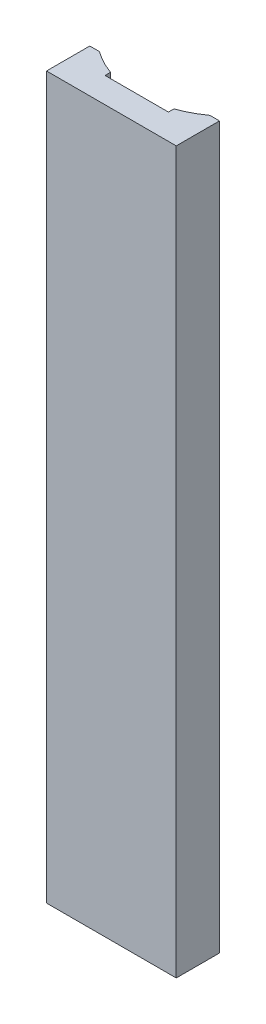
ISO-10303-21;
HEADER;
FILE_DESCRIPTION(('STEP AP214'),'2;1');
FILE_NAME('part.step','',(''),(''),'','','');
FILE_SCHEMA(('AUTOMOTIVE_DESIGN { 1 0 10303 214 1 1 1 1 }'));
ENDSEC;
DATA;
#1=APPLICATION_CONTEXT('core data for automotive mechanical design processes');
#2=APPLICATION_PROTOCOL_DEFINITION('international standard','automotive_design',2000,#1);
#3=PRODUCT_CONTEXT('',#1,'mechanical');
#4=PRODUCT('Part','Part','',(#3));
#5=PRODUCT_RELATED_PRODUCT_CATEGORY('part','',(#4));
#6=PRODUCT_DEFINITION_FORMATION('','',#4);
#7=PRODUCT_DEFINITION_CONTEXT('part definition',#1,'design');
#8=PRODUCT_DEFINITION('design','',#6,#7);
#9=PRODUCT_DEFINITION_SHAPE('','',#8);
#10=(LENGTH_UNIT() NAMED_UNIT(*) SI_UNIT(.MILLI.,.METRE.));
#11=(NAMED_UNIT(*) PLANE_ANGLE_UNIT() SI_UNIT($,.RADIAN.));
#12=(NAMED_UNIT(*) SI_UNIT($,.STERADIAN.) SOLID_ANGLE_UNIT());
#13=UNCERTAINTY_MEASURE_WITH_UNIT(LENGTH_MEASURE(1.E-05),#10,'distance_accuracy_value','');
#14=(GEOMETRIC_REPRESENTATION_CONTEXT(3) GLOBAL_UNCERTAINTY_ASSIGNED_CONTEXT((#13)) GLOBAL_UNIT_ASSIGNED_CONTEXT((#10,
#11,#12)) REPRESENTATION_CONTEXT('',''));
#15=CARTESIAN_POINT('',(0.,0.,0.));
#16=DIRECTION('',(0.,0.,1.));
#17=DIRECTION('',(1.,0.,0.));
#18=AXIS2_PLACEMENT_3D('',#15,#16,#17);
#19=CARTESIAN_POINT('',(0.,250.,-34.));
#20=DIRECTION('',(0.,-1.,0.));
#21=DIRECTION('',(0.,0.,-1.));
#22=AXIS2_PLACEMENT_3D('',#19,#20,#21);
#23=CYLINDRICAL_SURFACE('',#22,32.7);
#24=DIRECTION('',(0.,-1.,0.));
#25=VECTOR('',#24,1.);
#26=CARTESIAN_POINT('',(-11.,250.,-3.2056823423541));
#27=LINE('',#26,#25);
#28=CARTESIAN_POINT('',(-11.,0.,-3.2056823423541));
#29=VERTEX_POINT('',#28);
#30=CARTESIAN_POINT('',(-11.,250.,-3.2056823423541));
#31=VERTEX_POINT('',#30);
#32=EDGE_CURVE('E189',#29,#31,#27,.F.);
#33=ORIENTED_EDGE('',*,*,#32,.F.);
#34=CARTESIAN_POINT('',(0.,0.,-34.));
#35=DIRECTION('',(0.,1.,0.));
#36=DIRECTION('',(0.,0.,1.));
#37=AXIS2_PLACEMENT_3D('',#34,#35,#36);
#38=CIRCLE('',#37,32.7);
#39=CARTESIAN_POINT('',(-19.1582880237249,0.,-7.5));
#40=VERTEX_POINT('',#39);
#41=EDGE_CURVE('E141',#40,#29,#38,.T.);
#42=ORIENTED_EDGE('',*,*,#41,.F.);
#43=DIRECTION('',(0.,-1.,0.));
#44=VECTOR('',#43,1.);
#45=CARTESIAN_POINT('',(-19.1582880237249,250.,-7.5));
#46=LINE('',#45,#44);
#47=CARTESIAN_POINT('',(-19.1582880237249,250.,-7.5));
#48=VERTEX_POINT('',#47);
#49=EDGE_CURVE('E94',#48,#40,#46,.T.);
#50=ORIENTED_EDGE('',*,*,#49,.F.);
#51=CARTESIAN_POINT('',(0.,250.,-34.));
#52=DIRECTION('',(0.,1.,0.));
#53=DIRECTION('',(0.,0.,1.));
#54=AXIS2_PLACEMENT_3D('',#51,#52,#53);
#55=CIRCLE('',#54,32.7);
#56=EDGE_CURVE('E191',#48,#31,#55,.T.);
#57=ORIENTED_EDGE('',*,*,#56,.T.);
#58=EDGE_LOOP('',(#33,#42,#50,#57));
#59=FACE_BOUND('',#58,.T.);
#60=ADVANCED_FACE('F35',(#59),#23,.F.);
#61=DIRECTION('',(0.,-1.,0.));
#62=VECTOR('',#61,1.);
#63=CARTESIAN_POINT('',(11.,250.,-3.2056823423541));
#64=LINE('',#63,#62);
#65=CARTESIAN_POINT('',(11.,250.,-3.2056823423541));
#66=VERTEX_POINT('',#65);
#67=CARTESIAN_POINT('',(11.,0.,-3.2056823423541));
#68=VERTEX_POINT('',#67);
#69=EDGE_CURVE('E182',#66,#68,#64,.T.);
#70=ORIENTED_EDGE('',*,*,#69,.F.);
#71=CARTESIAN_POINT('',(19.1582880237249,250.,-7.5));
#72=VERTEX_POINT('',#71);
#73=EDGE_CURVE('E59',#66,#72,#55,.T.);
#74=ORIENTED_EDGE('',*,*,#73,.T.);
#75=DIRECTION('',(0.,-1.,0.));
#76=VECTOR('',#75,1.);
#77=CARTESIAN_POINT('',(19.1582880237249,250.,-7.5));
#78=LINE('',#77,#76);
#79=CARTESIAN_POINT('',(19.1582880237249,0.,-7.5));
#80=VERTEX_POINT('',#79);
#81=EDGE_CURVE('E136',#72,#80,#78,.T.);
#82=ORIENTED_EDGE('',*,*,#81,.T.);
#83=EDGE_CURVE('E87',#68,#80,#38,.T.);
#84=ORIENTED_EDGE('',*,*,#83,.F.);
#85=EDGE_LOOP('',(#70,#74,#82,#84));
#86=FACE_BOUND('',#85,.T.);
#87=ADVANCED_FACE('F37',(#86),#23,.F.);
#88=CARTESIAN_POINT('',(0.,250.,-7.5));
#89=DIRECTION('',(0.,0.,-1.));
#90=DIRECTION('',(-1.,0.,0.));
#91=AXIS2_PLACEMENT_3D('',#88,#89,#90);
#92=PLANE('',#91);
#93=DIRECTION('',(1.,0.,0.));
#94=VECTOR('',#93,1.);
#95=CARTESIAN_POINT('',(0.,0.,-7.5));
#96=LINE('',#95,#94);
#97=CARTESIAN_POINT('',(-22.5,0.,-7.5));
#98=VERTEX_POINT('',#97);
#99=EDGE_CURVE('E144',#98,#40,#96,.T.);
#100=ORIENTED_EDGE('',*,*,#99,.F.);
#101=DIRECTION('',(0.,-1.,0.));
#102=VECTOR('',#101,1.);
#103=CARTESIAN_POINT('',(-22.5,250.,-7.5));
#104=LINE('',#103,#102);
#105=CARTESIAN_POINT('',(-22.5,250.,-7.5));
#106=VERTEX_POINT('',#105);
#107=EDGE_CURVE('E156',#106,#98,#104,.T.);
#108=ORIENTED_EDGE('',*,*,#107,.F.);
#109=DIRECTION('',(1.,0.,0.));
#110=VECTOR('',#109,1.);
#111=CARTESIAN_POINT('',(0.,250.,-7.5));
#112=LINE('',#111,#110);
#113=EDGE_CURVE('E138',#106,#48,#112,.T.);
#114=ORIENTED_EDGE('',*,*,#113,.T.);
#115=ORIENTED_EDGE('',*,*,#49,.T.);
#116=EDGE_LOOP('',(#100,#108,#114,#115));
#117=FACE_BOUND('',#116,.T.);
#118=ADVANCED_FACE('F195',(#117),#92,.T.);
#119=CARTESIAN_POINT('',(-22.5,250.,0.));
#120=DIRECTION('',(1.,0.,0.));
#121=DIRECTION('',(0.,0.,-1.));
#122=AXIS2_PLACEMENT_3D('',#119,#120,#121);
#123=PLANE('',#122);
#124=DIRECTION('',(0.,0.,1.));
#125=VECTOR('',#124,1.);
#126=CARTESIAN_POINT('',(-22.5,0.,0.));
#127=LINE('',#126,#125);
#128=CARTESIAN_POINT('',(-22.5,0.,7.5));
#129=VERTEX_POINT('',#128);
#130=EDGE_CURVE('E147',#98,#129,#127,.T.);
#131=ORIENTED_EDGE('',*,*,#130,.T.);
#132=DIRECTION('',(0.,-1.,0.));
#133=VECTOR('',#132,1.);
#134=CARTESIAN_POINT('',(-22.5,250.,7.5));
#135=LINE('',#134,#133);
#136=CARTESIAN_POINT('',(-22.5,250.,7.5));
#137=VERTEX_POINT('',#136);
#138=EDGE_CURVE('E130',#137,#129,#135,.T.);
#139=ORIENTED_EDGE('',*,*,#138,.F.);
#140=DIRECTION('',(0.,0.,1.));
#141=VECTOR('',#140,1.);
#142=CARTESIAN_POINT('',(-22.5,250.,0.));
#143=LINE('',#142,#141);
#144=EDGE_CURVE('E117',#106,#137,#143,.T.);
#145=ORIENTED_EDGE('',*,*,#144,.F.);
#146=ORIENTED_EDGE('',*,*,#107,.T.);
#147=EDGE_LOOP('',(#131,#139,#145,#146));
#148=FACE_BOUND('',#147,.T.);
#149=ADVANCED_FACE('F221',(#148),#123,.F.);
#150=CARTESIAN_POINT('',(0.,250.,7.5));
#151=DIRECTION('',(0.,0.,-1.));
#152=DIRECTION('',(-1.,0.,0.));
#153=AXIS2_PLACEMENT_3D('',#150,#151,#152);
#154=PLANE('',#153);
#155=DIRECTION('',(1.,0.,0.));
#156=VECTOR('',#155,1.);
#157=CARTESIAN_POINT('',(0.,0.,7.5));
#158=LINE('',#157,#156);
#159=CARTESIAN_POINT('',(22.5,0.,7.5));
#160=VERTEX_POINT('',#159);
#161=EDGE_CURVE('E126',#129,#160,#158,.T.);
#162=ORIENTED_EDGE('',*,*,#161,.T.);
#163=DIRECTION('',(0.,-1.,0.));
#164=VECTOR('',#163,1.);
#165=CARTESIAN_POINT('',(22.5,250.,7.5));
#166=LINE('',#165,#164);
#167=CARTESIAN_POINT('',(22.5,250.,7.5));
#168=VERTEX_POINT('',#167);
#169=EDGE_CURVE('E123',#168,#160,#166,.T.);
#170=ORIENTED_EDGE('',*,*,#169,.F.);
#171=DIRECTION('',(1.,0.,0.));
#172=VECTOR('',#171,1.);
#173=CARTESIAN_POINT('',(0.,250.,7.5));
#174=LINE('',#173,#172);
#175=EDGE_CURVE('E107',#137,#168,#174,.T.);
#176=ORIENTED_EDGE('',*,*,#175,.F.);
#177=ORIENTED_EDGE('',*,*,#138,.T.);
#178=EDGE_LOOP('',(#162,#170,#176,#177));
#179=FACE_BOUND('',#178,.T.);
#180=ADVANCED_FACE('F124',(#179),#154,.F.);
#181=CARTESIAN_POINT('',(22.5,250.,0.));
#182=DIRECTION('',(1.,0.,0.));
#183=DIRECTION('',(0.,0.,-1.));
#184=AXIS2_PLACEMENT_3D('',#181,#182,#183);
#185=PLANE('',#184);
#186=DIRECTION('',(0.,0.,1.));
#187=VECTOR('',#186,1.);
#188=CARTESIAN_POINT('',(22.5,0.,0.));
#189=LINE('',#188,#187);
#190=CARTESIAN_POINT('',(22.5,0.,-7.5));
#191=VERTEX_POINT('',#190);
#192=EDGE_CURVE('E151',#191,#160,#189,.T.);
#193=ORIENTED_EDGE('',*,*,#192,.F.);
#194=DIRECTION('',(0.,-1.,0.));
#195=VECTOR('',#194,1.);
#196=CARTESIAN_POINT('',(22.5,250.,-7.5));
#197=LINE('',#196,#195);
#198=CARTESIAN_POINT('',(22.5,250.,-7.5));
#199=VERTEX_POINT('',#198);
#200=EDGE_CURVE('E131',#199,#191,#197,.T.);
#201=ORIENTED_EDGE('',*,*,#200,.F.);
#202=DIRECTION('',(0.,0.,1.));
#203=VECTOR('',#202,1.);
#204=CARTESIAN_POINT('',(22.5,250.,0.));
#205=LINE('',#204,#203);
#206=EDGE_CURVE('E113',#199,#168,#205,.T.);
#207=ORIENTED_EDGE('',*,*,#206,.T.);
#208=ORIENTED_EDGE('',*,*,#169,.T.);
#209=EDGE_LOOP('',(#193,#201,#207,#208));
#210=FACE_BOUND('',#209,.T.);
#211=ADVANCED_FACE('F133',(#210),#185,.T.);
#212=EDGE_CURVE('E148',#80,#191,#96,.T.);
#213=ORIENTED_EDGE('',*,*,#212,.F.);
#214=ORIENTED_EDGE('',*,*,#81,.F.);
#215=EDGE_CURVE('E134',#72,#199,#112,.T.);
#216=ORIENTED_EDGE('',*,*,#215,.T.);
#217=ORIENTED_EDGE('',*,*,#200,.T.);
#218=EDGE_LOOP('',(#213,#214,#216,#217));
#219=FACE_BOUND('',#218,.T.);
#220=ADVANCED_FACE('F210',(#219),#92,.T.);
#221=CARTESIAN_POINT('',(0.,250.,0.));
#222=DIRECTION('',(0.,1.,0.));
#223=DIRECTION('',(0.,0.,1.));
#224=AXIS2_PLACEMENT_3D('',#221,#222,#223);
#225=PLANE('',#224);
#226=DIRECTION('',(0.,0.,1.));
#227=VECTOR('',#226,1.);
#228=CARTESIAN_POINT('',(-11.,250.,-4.57072635705439));
#229=LINE('',#228,#227);
#230=CARTESIAN_POINT('',(-11.,250.,-1.29999999999997));
#231=VERTEX_POINT('',#230);
#232=EDGE_CURVE('E180',#31,#231,#229,.T.);
#233=ORIENTED_EDGE('',*,*,#232,.F.);
#234=ORIENTED_EDGE('',*,*,#56,.F.);
#235=ORIENTED_EDGE('',*,*,#113,.F.);
#236=ORIENTED_EDGE('',*,*,#144,.T.);
#237=ORIENTED_EDGE('',*,*,#175,.T.);
#238=ORIENTED_EDGE('',*,*,#206,.F.);
#239=ORIENTED_EDGE('',*,*,#215,.F.);
#240=ORIENTED_EDGE('',*,*,#73,.F.);
#241=DIRECTION('',(0.,0.,-1.));
#242=VECTOR('',#241,1.);
#243=CARTESIAN_POINT('',(11.,250.,-4.57072635705439));
#244=LINE('',#243,#242);
#245=CARTESIAN_POINT('',(11.,250.,-1.29999999999997));
#246=VERTEX_POINT('',#245);
#247=EDGE_CURVE('E184',#246,#66,#244,.T.);
#248=ORIENTED_EDGE('',*,*,#247,.F.);
#249=DIRECTION('',(1.,0.,0.));
#250=VECTOR('',#249,1.);
#251=CARTESIAN_POINT('',(-11.,250.,-1.29999999999997));
#252=LINE('',#251,#250);
#253=EDGE_CURVE('E204',#231,#246,#252,.T.);
#254=ORIENTED_EDGE('',*,*,#253,.F.);
#255=EDGE_LOOP('',(#233,#234,#235,#236,#237,#238,#239,#240,#248,#254));
#256=FACE_BOUND('',#255,.T.);
#257=ADVANCED_FACE('F110',(#256),#225,.T.);
#258=CARTESIAN_POINT('',(0.,0.,0.));
#259=DIRECTION('',(0.,1.,0.));
#260=DIRECTION('',(0.,0.,1.));
#261=AXIS2_PLACEMENT_3D('',#258,#259,#260);
#262=PLANE('',#261);
#263=ORIENTED_EDGE('',*,*,#41,.T.);
#264=DIRECTION('',(0.,0.,1.));
#265=VECTOR('',#264,1.);
#266=CARTESIAN_POINT('',(-11.,0.,0.));
#267=LINE('',#266,#265);
#268=CARTESIAN_POINT('',(-11.,0.,-1.29999999999997));
#269=VERTEX_POINT('',#268);
#270=EDGE_CURVE('E11',#29,#269,#267,.T.);
#271=ORIENTED_EDGE('',*,*,#270,.T.);
#272=DIRECTION('',(1.,0.,0.));
#273=VECTOR('',#272,1.);
#274=CARTESIAN_POINT('',(0.,0.,-1.29999999999997));
#275=LINE('',#274,#273);
#276=CARTESIAN_POINT('',(11.,0.,-1.29999999999997));
#277=VERTEX_POINT('',#276);
#278=EDGE_CURVE('E43',#269,#277,#275,.T.);
#279=ORIENTED_EDGE('',*,*,#278,.T.);
#280=DIRECTION('',(0.,0.,-1.));
#281=VECTOR('',#280,1.);
#282=CARTESIAN_POINT('',(11.,0.,-4.57072635705439));
#283=LINE('',#282,#281);
#284=EDGE_CURVE('E50',#277,#68,#283,.T.);
#285=ORIENTED_EDGE('',*,*,#284,.T.);
#286=ORIENTED_EDGE('',*,*,#83,.T.);
#287=ORIENTED_EDGE('',*,*,#212,.T.);
#288=ORIENTED_EDGE('',*,*,#192,.T.);
#289=ORIENTED_EDGE('',*,*,#161,.F.);
#290=ORIENTED_EDGE('',*,*,#130,.F.);
#291=ORIENTED_EDGE('',*,*,#99,.T.);
#292=EDGE_LOOP('',(#263,#271,#279,#285,#286,#287,#288,#289,#290,#291));
#293=FACE_BOUND('',#292,.T.);
#294=ADVANCED_FACE('F160',(#293),#262,.F.);
#295=CARTESIAN_POINT('',(-11.,0.,-1.29999999999997));
#296=DIRECTION('',(0.,0.,1.));
#297=DIRECTION('',(1.,0.,0.));
#298=AXIS2_PLACEMENT_3D('',#295,#296,#297);
#299=PLANE('',#298);
#300=ORIENTED_EDGE('',*,*,#253,.T.);
#301=DIRECTION('',(0.,1.,0.));
#302=VECTOR('',#301,1.);
#303=CARTESIAN_POINT('',(11.,0.,-1.29999999999997));
#304=LINE('',#303,#302);
#305=EDGE_CURVE('E171',#277,#246,#304,.T.);
#306=ORIENTED_EDGE('',*,*,#305,.F.);
#307=ORIENTED_EDGE('',*,*,#278,.F.);
#308=DIRECTION('',(0.,1.,0.));
#309=VECTOR('',#308,1.);
#310=CARTESIAN_POINT('',(-11.,0.,-1.29999999999997));
#311=LINE('',#310,#309);
#312=EDGE_CURVE('E170',#269,#231,#311,.T.);
#313=ORIENTED_EDGE('',*,*,#312,.T.);
#314=EDGE_LOOP('',(#300,#306,#307,#313));
#315=FACE_BOUND('',#314,.T.);
#316=ADVANCED_FACE('F168',(#315),#299,.F.);
#317=CARTESIAN_POINT('',(-11.,0.,-4.57072635705439));
#318=DIRECTION('',(-1.,0.,0.));
#319=DIRECTION('',(0.,0.,1.));
#320=AXIS2_PLACEMENT_3D('',#317,#318,#319);
#321=PLANE('',#320);
#322=ORIENTED_EDGE('',*,*,#32,.T.);
#323=ORIENTED_EDGE('',*,*,#232,.T.);
#324=ORIENTED_EDGE('',*,*,#312,.F.);
#325=ORIENTED_EDGE('',*,*,#270,.F.);
#326=EDGE_LOOP('',(#322,#323,#324,#325));
#327=FACE_BOUND('',#326,.T.);
#328=ADVANCED_FACE('F178',(#327),#321,.F.);
#329=CARTESIAN_POINT('',(11.,0.,-4.57072635705439));
#330=DIRECTION('',(1.,0.,0.));
#331=DIRECTION('',(0.,0.,-1.));
#332=AXIS2_PLACEMENT_3D('',#329,#330,#331);
#333=PLANE('',#332);
#334=ORIENTED_EDGE('',*,*,#69,.T.);
#335=ORIENTED_EDGE('',*,*,#284,.F.);
#336=ORIENTED_EDGE('',*,*,#305,.T.);
#337=ORIENTED_EDGE('',*,*,#247,.T.);
#338=EDGE_LOOP('',(#334,#335,#336,#337));
#339=FACE_BOUND('',#338,.T.);
#340=ADVANCED_FACE('F207',(#339),#333,.F.);
#341=CLOSED_SHELL('',(#60,#87,#118,#149,#180,#211,#220,#257,#294,#316,#328,#340));
#342=MANIFOLD_SOLID_BREP('B2',#341);
#343=ADVANCED_BREP_SHAPE_REPRESENTATION('',(#18,#342),#14);
#344=SHAPE_DEFINITION_REPRESENTATION(#9,#343);
ENDSEC;
END-ISO-10303-21;
